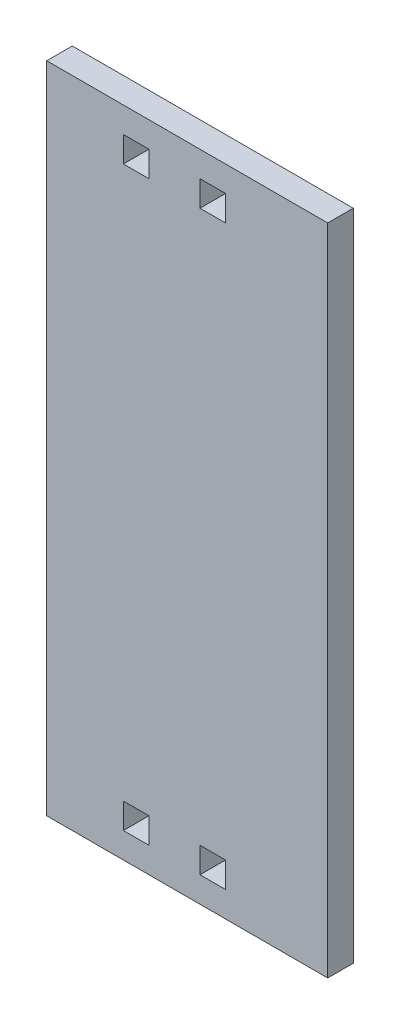
ISO-10303-21;
HEADER;
FILE_DESCRIPTION(('STEP AP214'),'2;1');
FILE_NAME('part.step','',(''),(''),'','','');
FILE_SCHEMA(('AUTOMOTIVE_DESIGN { 1 0 10303 214 1 1 1 1 }'));
ENDSEC;
DATA;
#1=APPLICATION_CONTEXT('core data for automotive mechanical design processes');
#2=APPLICATION_PROTOCOL_DEFINITION('international standard','automotive_design',2000,#1);
#3=PRODUCT_CONTEXT('',#1,'mechanical');
#4=PRODUCT('Part','Part','',(#3));
#5=PRODUCT_RELATED_PRODUCT_CATEGORY('part','',(#4));
#6=PRODUCT_DEFINITION_FORMATION('','',#4);
#7=PRODUCT_DEFINITION_CONTEXT('part definition',#1,'design');
#8=PRODUCT_DEFINITION('design','',#6,#7);
#9=PRODUCT_DEFINITION_SHAPE('','',#8);
#10=(LENGTH_UNIT() NAMED_UNIT(*) SI_UNIT(.MILLI.,.METRE.));
#11=(NAMED_UNIT(*) PLANE_ANGLE_UNIT() SI_UNIT($,.RADIAN.));
#12=(NAMED_UNIT(*) SI_UNIT($,.STERADIAN.) SOLID_ANGLE_UNIT());
#13=UNCERTAINTY_MEASURE_WITH_UNIT(LENGTH_MEASURE(1.E-05),#10,'distance_accuracy_value','');
#14=(GEOMETRIC_REPRESENTATION_CONTEXT(3) GLOBAL_UNCERTAINTY_ASSIGNED_CONTEXT((#13)) GLOBAL_UNIT_ASSIGNED_CONTEXT((#10,
#11,#12)) REPRESENTATION_CONTEXT('',''));
#15=CARTESIAN_POINT('',(0.,0.,0.));
#16=DIRECTION('',(0.,0.,1.));
#17=DIRECTION('',(1.,0.,0.));
#18=AXIS2_PLACEMENT_3D('',#15,#16,#17);
#19=CARTESIAN_POINT('',(0.,110.5,5.));
#20=DIRECTION('',(0.,-1.,0.));
#21=DIRECTION('',(0.,0.,-1.));
#22=AXIS2_PLACEMENT_3D('',#19,#20,#21);
#23=PLANE('',#22);
#24=DIRECTION('',(-1.,0.,0.));
#25=VECTOR('',#24,1.);
#26=CARTESIAN_POINT('',(0.,110.5,0.));
#27=LINE('',#26,#25);
#28=CARTESIAN_POINT('',(-4.99999999999998,110.5,0.));
#29=VERTEX_POINT('',#28);
#30=CARTESIAN_POINT('',(-9.99999999999999,110.5,0.));
#31=VERTEX_POINT('',#30);
#32=EDGE_CURVE('E403',#29,#31,#27,.T.);
#33=ORIENTED_EDGE('',*,*,#32,.T.);
#34=DIRECTION('',(0.,0.,-1.));
#35=VECTOR('',#34,1.);
#36=CARTESIAN_POINT('',(-9.99999999999999,110.5,5.));
#37=LINE('',#36,#35);
#38=CARTESIAN_POINT('',(-9.99999999999999,110.5,5.));
#39=VERTEX_POINT('',#38);
#40=EDGE_CURVE('E12',#39,#31,#37,.T.);
#41=ORIENTED_EDGE('',*,*,#40,.F.);
#42=DIRECTION('',(-1.,0.,0.));
#43=VECTOR('',#42,1.);
#44=CARTESIAN_POINT('',(0.,110.5,5.));
#45=LINE('',#44,#43);
#46=CARTESIAN_POINT('',(-4.99999999999998,110.5,5.));
#47=VERTEX_POINT('',#46);
#48=EDGE_CURVE('E193',#47,#39,#45,.T.);
#49=ORIENTED_EDGE('',*,*,#48,.F.);
#50=DIRECTION('',(0.,0.,-1.));
#51=VECTOR('',#50,1.);
#52=CARTESIAN_POINT('',(-4.99999999999998,110.5,5.));
#53=LINE('',#52,#51);
#54=EDGE_CURVE('E61',#47,#29,#53,.T.);
#55=ORIENTED_EDGE('',*,*,#54,.T.);
#56=EDGE_LOOP('',(#33,#41,#49,#55));
#57=FACE_BOUND('',#56,.T.);
#58=ADVANCED_FACE('F42',(#57),#23,.F.);
#59=CARTESIAN_POINT('',(-9.99999999999999,0.,5.));
#60=DIRECTION('',(-1.,0.,0.));
#61=DIRECTION('',(0.,0.,1.));
#62=AXIS2_PLACEMENT_3D('',#59,#60,#61);
#63=PLANE('',#62);
#64=DIRECTION('',(0.,1.,0.));
#65=VECTOR('',#64,1.);
#66=CARTESIAN_POINT('',(-9.99999999999999,0.,0.));
#67=LINE('',#66,#65);
#68=CARTESIAN_POINT('',(-9.99999999999999,115.5,0.));
#69=VERTEX_POINT('',#68);
#70=EDGE_CURVE('E200',#31,#69,#67,.T.);
#71=ORIENTED_EDGE('',*,*,#70,.T.);
#72=DIRECTION('',(0.,0.,-1.));
#73=VECTOR('',#72,1.);
#74=CARTESIAN_POINT('',(-9.99999999999999,115.5,5.));
#75=LINE('',#74,#73);
#76=CARTESIAN_POINT('',(-9.99999999999999,115.5,5.));
#77=VERTEX_POINT('',#76);
#78=EDGE_CURVE('E52',#77,#69,#75,.T.);
#79=ORIENTED_EDGE('',*,*,#78,.F.);
#80=DIRECTION('',(0.,1.,0.));
#81=VECTOR('',#80,1.);
#82=CARTESIAN_POINT('',(-9.99999999999999,0.,5.));
#83=LINE('',#82,#81);
#84=EDGE_CURVE('E187',#39,#77,#83,.T.);
#85=ORIENTED_EDGE('',*,*,#84,.F.);
#86=ORIENTED_EDGE('',*,*,#40,.T.);
#87=EDGE_LOOP('',(#71,#79,#85,#86));
#88=FACE_BOUND('',#87,.T.);
#89=ADVANCED_FACE('F199',(#88),#63,.F.);
#90=CARTESIAN_POINT('',(0.,115.5,5.));
#91=DIRECTION('',(0.,-1.,0.));
#92=DIRECTION('',(0.,0.,-1.));
#93=AXIS2_PLACEMENT_3D('',#90,#91,#92);
#94=PLANE('',#93);
#95=DIRECTION('',(-1.,0.,0.));
#96=VECTOR('',#95,1.);
#97=CARTESIAN_POINT('',(0.,115.5,0.));
#98=LINE('',#97,#96);
#99=CARTESIAN_POINT('',(-4.99999999999998,115.5,0.));
#100=VERTEX_POINT('',#99);
#101=EDGE_CURVE('E306',#100,#69,#98,.T.);
#102=ORIENTED_EDGE('',*,*,#101,.F.);
#103=DIRECTION('',(0.,0.,-1.));
#104=VECTOR('',#103,1.);
#105=CARTESIAN_POINT('',(-4.99999999999998,115.5,5.));
#106=LINE('',#105,#104);
#107=CARTESIAN_POINT('',(-4.99999999999998,115.5,5.));
#108=VERTEX_POINT('',#107);
#109=EDGE_CURVE('E123',#108,#100,#106,.T.);
#110=ORIENTED_EDGE('',*,*,#109,.F.);
#111=DIRECTION('',(-1.,0.,0.));
#112=VECTOR('',#111,1.);
#113=CARTESIAN_POINT('',(0.,115.5,5.));
#114=LINE('',#113,#112);
#115=EDGE_CURVE('E192',#108,#77,#114,.T.);
#116=ORIENTED_EDGE('',*,*,#115,.T.);
#117=ORIENTED_EDGE('',*,*,#78,.T.);
#118=EDGE_LOOP('',(#102,#110,#116,#117));
#119=FACE_BOUND('',#118,.T.);
#120=ADVANCED_FACE('F204',(#119),#94,.T.);
#121=CARTESIAN_POINT('',(0.,2.5,5.));
#122=DIRECTION('',(0.,1.,0.));
#123=DIRECTION('',(0.,0.,1.));
#124=AXIS2_PLACEMENT_3D('',#121,#122,#123);
#125=PLANE('',#124);
#126=DIRECTION('',(1.,0.,0.));
#127=VECTOR('',#126,1.);
#128=CARTESIAN_POINT('',(0.,2.5,0.));
#129=LINE('',#128,#127);
#130=CARTESIAN_POINT('',(5.,2.5,0.));
#131=VERTEX_POINT('',#130);
#132=CARTESIAN_POINT('',(10.,2.5,0.));
#133=VERTEX_POINT('',#132);
#134=EDGE_CURVE('E391',#131,#133,#129,.T.);
#135=ORIENTED_EDGE('',*,*,#134,.T.);
#136=DIRECTION('',(0.,0.,-1.));
#137=VECTOR('',#136,1.);
#138=CARTESIAN_POINT('',(10.,2.5,5.));
#139=LINE('',#138,#137);
#140=CARTESIAN_POINT('',(10.,2.5,5.));
#141=VERTEX_POINT('',#140);
#142=EDGE_CURVE('E313',#141,#133,#139,.T.);
#143=ORIENTED_EDGE('',*,*,#142,.F.);
#144=DIRECTION('',(1.,0.,0.));
#145=VECTOR('',#144,1.);
#146=CARTESIAN_POINT('',(0.,2.5,5.));
#147=LINE('',#146,#145);
#148=CARTESIAN_POINT('',(5.,2.5,5.));
#149=VERTEX_POINT('',#148);
#150=EDGE_CURVE('E240',#149,#141,#147,.T.);
#151=ORIENTED_EDGE('',*,*,#150,.F.);
#152=DIRECTION('',(0.,0.,-1.));
#153=VECTOR('',#152,1.);
#154=CARTESIAN_POINT('',(5.,2.5,5.));
#155=LINE('',#154,#153);
#156=EDGE_CURVE('E315',#149,#131,#155,.T.);
#157=ORIENTED_EDGE('',*,*,#156,.T.);
#158=EDGE_LOOP('',(#135,#143,#151,#157));
#159=FACE_BOUND('',#158,.T.);
#160=ADVANCED_FACE('F440',(#159),#125,.F.);
#161=CARTESIAN_POINT('',(10.,0.,5.));
#162=DIRECTION('',(1.,0.,0.));
#163=DIRECTION('',(0.,0.,-1.));
#164=AXIS2_PLACEMENT_3D('',#161,#162,#163);
#165=PLANE('',#164);
#166=DIRECTION('',(0.,-1.,0.));
#167=VECTOR('',#166,1.);
#168=CARTESIAN_POINT('',(10.,0.,0.));
#169=LINE('',#168,#167);
#170=CARTESIAN_POINT('',(10.,-2.5,0.));
#171=VERTEX_POINT('',#170);
#172=EDGE_CURVE('E394',#133,#171,#169,.T.);
#173=ORIENTED_EDGE('',*,*,#172,.T.);
#174=DIRECTION('',(0.,0.,-1.));
#175=VECTOR('',#174,1.);
#176=CARTESIAN_POINT('',(10.,-2.5,5.));
#177=LINE('',#176,#175);
#178=CARTESIAN_POINT('',(10.,-2.5,5.));
#179=VERTEX_POINT('',#178);
#180=EDGE_CURVE('E320',#179,#171,#177,.T.);
#181=ORIENTED_EDGE('',*,*,#180,.F.);
#182=DIRECTION('',(0.,-1.,0.));
#183=VECTOR('',#182,1.);
#184=CARTESIAN_POINT('',(10.,0.,5.));
#185=LINE('',#184,#183);
#186=EDGE_CURVE('E232',#141,#179,#185,.T.);
#187=ORIENTED_EDGE('',*,*,#186,.F.);
#188=ORIENTED_EDGE('',*,*,#142,.T.);
#189=EDGE_LOOP('',(#173,#181,#187,#188));
#190=FACE_BOUND('',#189,.T.);
#191=ADVANCED_FACE('F436',(#190),#165,.F.);
#192=CARTESIAN_POINT('',(0.,-2.5,5.));
#193=DIRECTION('',(0.,1.,0.));
#194=DIRECTION('',(0.,0.,1.));
#195=AXIS2_PLACEMENT_3D('',#192,#193,#194);
#196=PLANE('',#195);
#197=DIRECTION('',(1.,0.,0.));
#198=VECTOR('',#197,1.);
#199=CARTESIAN_POINT('',(0.,-2.5,0.));
#200=LINE('',#199,#198);
#201=CARTESIAN_POINT('',(5.,-2.5,0.));
#202=VERTEX_POINT('',#201);
#203=EDGE_CURVE('E397',#202,#171,#200,.T.);
#204=ORIENTED_EDGE('',*,*,#203,.F.);
#205=DIRECTION('',(0.,0.,-1.));
#206=VECTOR('',#205,1.);
#207=CARTESIAN_POINT('',(5.,-2.5,5.));
#208=LINE('',#207,#206);
#209=CARTESIAN_POINT('',(5.,-2.5,5.));
#210=VERTEX_POINT('',#209);
#211=EDGE_CURVE('E317',#210,#202,#208,.T.);
#212=ORIENTED_EDGE('',*,*,#211,.F.);
#213=DIRECTION('',(1.,0.,0.));
#214=VECTOR('',#213,1.);
#215=CARTESIAN_POINT('',(0.,-2.5,5.));
#216=LINE('',#215,#214);
#217=EDGE_CURVE('E227',#210,#179,#216,.T.);
#218=ORIENTED_EDGE('',*,*,#217,.T.);
#219=ORIENTED_EDGE('',*,*,#180,.T.);
#220=EDGE_LOOP('',(#204,#212,#218,#219));
#221=FACE_BOUND('',#220,.T.);
#222=ADVANCED_FACE('F432',(#221),#196,.T.);
#223=CARTESIAN_POINT('',(0.,-7.5,5.));
#224=DIRECTION('',(0.,-1.,0.));
#225=DIRECTION('',(1.,0.,0.));
#226=AXIS2_PLACEMENT_3D('',#223,#224,#225);
#227=PLANE('',#226);
#228=DIRECTION('',(-1.,0.,0.));
#229=VECTOR('',#228,1.);
#230=CARTESIAN_POINT('',(0.,-7.5,0.));
#231=LINE('',#230,#229);
#232=CARTESIAN_POINT('',(30.,-7.5,0.));
#233=VERTEX_POINT('',#232);
#234=CARTESIAN_POINT('',(-25.,-7.50000000000001,0.));
#235=VERTEX_POINT('',#234);
#236=EDGE_CURVE('E379',#233,#235,#231,.T.);
#237=ORIENTED_EDGE('',*,*,#236,.F.);
#238=DIRECTION('',(0.,0.,-1.));
#239=VECTOR('',#238,1.);
#240=CARTESIAN_POINT('',(30.,-7.5,5.));
#241=LINE('',#240,#239);
#242=CARTESIAN_POINT('',(30.,-7.5,5.));
#243=VERTEX_POINT('',#242);
#244=EDGE_CURVE('E318',#243,#233,#241,.T.);
#245=ORIENTED_EDGE('',*,*,#244,.F.);
#246=DIRECTION('',(-1.,0.,0.));
#247=VECTOR('',#246,1.);
#248=CARTESIAN_POINT('',(0.,-7.5,5.));
#249=LINE('',#248,#247);
#250=CARTESIAN_POINT('',(-25.,-7.50000000000001,5.));
#251=VERTEX_POINT('',#250);
#252=EDGE_CURVE('E261',#243,#251,#249,.T.);
#253=ORIENTED_EDGE('',*,*,#252,.T.);
#254=DIRECTION('',(0.,0.,-1.));
#255=VECTOR('',#254,1.);
#256=CARTESIAN_POINT('',(-25.,-7.50000000000001,5.));
#257=LINE('',#256,#255);
#258=EDGE_CURVE('E324',#251,#235,#257,.T.);
#259=ORIENTED_EDGE('',*,*,#258,.T.);
#260=EDGE_LOOP('',(#237,#245,#253,#259));
#261=FACE_BOUND('',#260,.T.);
#262=ADVANCED_FACE('F435',(#261),#227,.T.);
#263=CARTESIAN_POINT('',(30.,0.,5.));
#264=DIRECTION('',(1.,0.,0.));
#265=DIRECTION('',(0.,1.,0.));
#266=AXIS2_PLACEMENT_3D('',#263,#264,#265);
#267=PLANE('',#266);
#268=DIRECTION('',(0.,-1.,0.));
#269=VECTOR('',#268,1.);
#270=CARTESIAN_POINT('',(30.,0.,0.));
#271=LINE('',#270,#269);
#272=CARTESIAN_POINT('',(30.,120.5,0.));
#273=VERTEX_POINT('',#272);
#274=EDGE_CURVE('E382',#273,#233,#271,.T.);
#275=ORIENTED_EDGE('',*,*,#274,.F.);
#276=DIRECTION('',(0.,0.,-1.));
#277=VECTOR('',#276,1.);
#278=CARTESIAN_POINT('',(30.,120.5,5.));
#279=LINE('',#278,#277);
#280=CARTESIAN_POINT('',(30.,120.5,5.));
#281=VERTEX_POINT('',#280);
#282=EDGE_CURVE('E329',#281,#273,#279,.T.);
#283=ORIENTED_EDGE('',*,*,#282,.F.);
#284=DIRECTION('',(0.,-1.,0.));
#285=VECTOR('',#284,1.);
#286=CARTESIAN_POINT('',(30.,0.,5.));
#287=LINE('',#286,#285);
#288=EDGE_CURVE('E253',#281,#243,#287,.T.);
#289=ORIENTED_EDGE('',*,*,#288,.T.);
#290=ORIENTED_EDGE('',*,*,#244,.T.);
#291=EDGE_LOOP('',(#275,#283,#289,#290));
#292=FACE_BOUND('',#291,.T.);
#293=ADVANCED_FACE('F452',(#292),#267,.T.);
#294=CARTESIAN_POINT('',(0.,120.5,5.));
#295=DIRECTION('',(0.,1.,0.));
#296=DIRECTION('',(0.,0.,1.));
#297=AXIS2_PLACEMENT_3D('',#294,#295,#296);
#298=PLANE('',#297);
#299=DIRECTION('',(1.,0.,0.));
#300=VECTOR('',#299,1.);
#301=CARTESIAN_POINT('',(0.,120.5,0.));
#302=LINE('',#301,#300);
#303=CARTESIAN_POINT('',(-25.,120.5,0.));
#304=VERTEX_POINT('',#303);
#305=EDGE_CURVE('E385',#304,#273,#302,.T.);
#306=ORIENTED_EDGE('',*,*,#305,.F.);
#307=DIRECTION('',(0.,0.,-1.));
#308=VECTOR('',#307,1.);
#309=CARTESIAN_POINT('',(-25.,120.5,5.));
#310=LINE('',#309,#308);
#311=CARTESIAN_POINT('',(-25.,120.5,5.));
#312=VERTEX_POINT('',#311);
#313=EDGE_CURVE('E326',#312,#304,#310,.T.);
#314=ORIENTED_EDGE('',*,*,#313,.F.);
#315=DIRECTION('',(1.,0.,0.));
#316=VECTOR('',#315,1.);
#317=CARTESIAN_POINT('',(0.,120.5,5.));
#318=LINE('',#317,#316);
#319=EDGE_CURVE('E248',#312,#281,#318,.T.);
#320=ORIENTED_EDGE('',*,*,#319,.T.);
#321=ORIENTED_EDGE('',*,*,#282,.T.);
#322=EDGE_LOOP('',(#306,#314,#320,#321));
#323=FACE_BOUND('',#322,.T.);
#324=ADVANCED_FACE('F448',(#323),#298,.T.);
#325=CARTESIAN_POINT('',(-10.,0.,5.));
#326=DIRECTION('',(1.,0.,0.));
#327=DIRECTION('',(0.,0.,-1.));
#328=AXIS2_PLACEMENT_3D('',#325,#326,#327);
#329=PLANE('',#328);
#330=DIRECTION('',(0.,-1.,0.));
#331=VECTOR('',#330,1.);
#332=CARTESIAN_POINT('',(-10.,0.,0.));
#333=LINE('',#332,#331);
#334=CARTESIAN_POINT('',(-10.,2.5,0.));
#335=VERTEX_POINT('',#334);
#336=CARTESIAN_POINT('',(-10.,-2.5,0.));
#337=VERTEX_POINT('',#336);
#338=EDGE_CURVE('E367',#335,#337,#333,.T.);
#339=ORIENTED_EDGE('',*,*,#338,.F.);
#340=DIRECTION('',(0.,0.,-1.));
#341=VECTOR('',#340,1.);
#342=CARTESIAN_POINT('',(-10.,2.5,5.));
#343=LINE('',#342,#341);
#344=CARTESIAN_POINT('',(-10.,2.5,5.));
#345=VERTEX_POINT('',#344);
#346=EDGE_CURVE('E327',#345,#335,#343,.T.);
#347=ORIENTED_EDGE('',*,*,#346,.F.);
#348=DIRECTION('',(0.,-1.,0.));
#349=VECTOR('',#348,1.);
#350=CARTESIAN_POINT('',(-10.,0.,5.));
#351=LINE('',#350,#349);
#352=CARTESIAN_POINT('',(-10.,-2.5,5.));
#353=VERTEX_POINT('',#352);
#354=EDGE_CURVE('E282',#345,#353,#351,.T.);
#355=ORIENTED_EDGE('',*,*,#354,.T.);
#356=DIRECTION('',(0.,0.,-1.));
#357=VECTOR('',#356,1.);
#358=CARTESIAN_POINT('',(-10.,-2.5,5.));
#359=LINE('',#358,#357);
#360=EDGE_CURVE('E332',#353,#337,#359,.T.);
#361=ORIENTED_EDGE('',*,*,#360,.T.);
#362=EDGE_LOOP('',(#339,#347,#355,#361));
#363=FACE_BOUND('',#362,.T.);
#364=ADVANCED_FACE('F451',(#363),#329,.T.);
#365=CARTESIAN_POINT('',(0.,2.5,5.));
#366=DIRECTION('',(0.,-1.,0.));
#367=DIRECTION('',(1.,0.,0.));
#368=AXIS2_PLACEMENT_3D('',#365,#366,#367);
#369=PLANE('',#368);
#370=DIRECTION('',(-1.,0.,0.));
#371=VECTOR('',#370,1.);
#372=CARTESIAN_POINT('',(0.,2.5,0.));
#373=LINE('',#372,#371);
#374=CARTESIAN_POINT('',(-5.,2.5,0.));
#375=VERTEX_POINT('',#374);
#376=EDGE_CURVE('E370',#375,#335,#373,.T.);
#377=ORIENTED_EDGE('',*,*,#376,.F.);
#378=DIRECTION('',(0.,0.,-1.));
#379=VECTOR('',#378,1.);
#380=CARTESIAN_POINT('',(-5.,2.5,5.));
#381=LINE('',#380,#379);
#382=CARTESIAN_POINT('',(-5.,2.5,5.));
#383=VERTEX_POINT('',#382);
#384=EDGE_CURVE('E337',#383,#375,#381,.T.);
#385=ORIENTED_EDGE('',*,*,#384,.F.);
#386=DIRECTION('',(-1.,0.,0.));
#387=VECTOR('',#386,1.);
#388=CARTESIAN_POINT('',(0.,2.5,5.));
#389=LINE('',#388,#387);
#390=EDGE_CURVE('E274',#383,#345,#389,.T.);
#391=ORIENTED_EDGE('',*,*,#390,.T.);
#392=ORIENTED_EDGE('',*,*,#346,.T.);
#393=EDGE_LOOP('',(#377,#385,#391,#392));
#394=FACE_BOUND('',#393,.T.);
#395=ADVANCED_FACE('F466',(#394),#369,.T.);
#396=CARTESIAN_POINT('',(-5.,0.,5.));
#397=DIRECTION('',(1.,0.,0.));
#398=DIRECTION('',(0.,0.,-1.));
#399=AXIS2_PLACEMENT_3D('',#396,#397,#398);
#400=PLANE('',#399);
#401=DIRECTION('',(0.,-1.,0.));
#402=VECTOR('',#401,1.);
#403=CARTESIAN_POINT('',(-5.,0.,0.));
#404=LINE('',#403,#402);
#405=CARTESIAN_POINT('',(-5.,-2.5,0.));
#406=VERTEX_POINT('',#405);
#407=EDGE_CURVE('E373',#375,#406,#404,.T.);
#408=ORIENTED_EDGE('',*,*,#407,.T.);
#409=DIRECTION('',(0.,0.,-1.));
#410=VECTOR('',#409,1.);
#411=CARTESIAN_POINT('',(-5.,-2.5,5.));
#412=LINE('',#411,#410);
#413=CARTESIAN_POINT('',(-5.,-2.5,5.));
#414=VERTEX_POINT('',#413);
#415=EDGE_CURVE('E334',#414,#406,#412,.T.);
#416=ORIENTED_EDGE('',*,*,#415,.F.);
#417=DIRECTION('',(0.,-1.,0.));
#418=VECTOR('',#417,1.);
#419=CARTESIAN_POINT('',(-5.,0.,5.));
#420=LINE('',#419,#418);
#421=EDGE_CURVE('E269',#383,#414,#420,.T.);
#422=ORIENTED_EDGE('',*,*,#421,.F.);
#423=ORIENTED_EDGE('',*,*,#384,.T.);
#424=EDGE_LOOP('',(#408,#416,#422,#423));
#425=FACE_BOUND('',#424,.T.);
#426=ADVANCED_FACE('F463',(#425),#400,.F.);
#427=CARTESIAN_POINT('',(10.,0.,5.));
#428=DIRECTION('',(-1.,0.,0.));
#429=DIRECTION('',(0.,0.,1.));
#430=AXIS2_PLACEMENT_3D('',#427,#428,#429);
#431=PLANE('',#430);
#432=DIRECTION('',(0.,1.,0.));
#433=VECTOR('',#432,1.);
#434=CARTESIAN_POINT('',(10.,0.,0.));
#435=LINE('',#434,#433);
#436=CARTESIAN_POINT('',(10.,110.5,0.));
#437=VERTEX_POINT('',#436);
#438=CARTESIAN_POINT('',(10.,115.5,0.));
#439=VERTEX_POINT('',#438);
#440=EDGE_CURVE('E354',#437,#439,#435,.T.);
#441=ORIENTED_EDGE('',*,*,#440,.F.);
#442=DIRECTION('',(0.,0.,-1.));
#443=VECTOR('',#442,1.);
#444=CARTESIAN_POINT('',(10.,110.5,5.));
#445=LINE('',#444,#443);
#446=CARTESIAN_POINT('',(10.,110.5,5.));
#447=VERTEX_POINT('',#446);
#448=EDGE_CURVE('E46',#447,#437,#445,.T.);
#449=ORIENTED_EDGE('',*,*,#448,.F.);
#450=DIRECTION('',(0.,1.,0.));
#451=VECTOR('',#450,1.);
#452=CARTESIAN_POINT('',(10.,0.,5.));
#453=LINE('',#452,#451);
#454=CARTESIAN_POINT('',(10.,115.5,5.));
#455=VERTEX_POINT('',#454);
#456=EDGE_CURVE('E299',#447,#455,#453,.T.);
#457=ORIENTED_EDGE('',*,*,#456,.T.);
#458=DIRECTION('',(0.,0.,-1.));
#459=VECTOR('',#458,1.);
#460=CARTESIAN_POINT('',(10.,115.5,5.));
#461=LINE('',#460,#459);
#462=EDGE_CURVE('E209',#455,#439,#461,.T.);
#463=ORIENTED_EDGE('',*,*,#462,.T.);
#464=EDGE_LOOP('',(#441,#449,#457,#463));
#465=FACE_BOUND('',#464,.T.);
#466=ADVANCED_FACE('F44',(#465),#431,.T.);
#467=CARTESIAN_POINT('',(0.,110.5,5.));
#468=DIRECTION('',(0.,1.,0.));
#469=DIRECTION('',(0.,0.,1.));
#470=AXIS2_PLACEMENT_3D('',#467,#468,#469);
#471=PLANE('',#470);
#472=DIRECTION('',(1.,0.,0.));
#473=VECTOR('',#472,1.);
#474=CARTESIAN_POINT('',(0.,110.5,0.));
#475=LINE('',#474,#473);
#476=CARTESIAN_POINT('',(5.00000000000002,110.5,0.));
#477=VERTEX_POINT('',#476);
#478=EDGE_CURVE('E351',#477,#437,#475,.T.);
#479=ORIENTED_EDGE('',*,*,#478,.F.);
#480=DIRECTION('',(0.,0.,-1.));
#481=VECTOR('',#480,1.);
#482=CARTESIAN_POINT('',(5.00000000000002,110.5,5.));
#483=LINE('',#482,#481);
#484=CARTESIAN_POINT('',(5.00000000000002,110.5,5.));
#485=VERTEX_POINT('',#484);
#486=EDGE_CURVE('E343',#485,#477,#483,.T.);
#487=ORIENTED_EDGE('',*,*,#486,.F.);
#488=DIRECTION('',(1.,0.,0.));
#489=VECTOR('',#488,1.);
#490=CARTESIAN_POINT('',(0.,110.5,5.));
#491=LINE('',#490,#489);
#492=EDGE_CURVE('E294',#485,#447,#491,.T.);
#493=ORIENTED_EDGE('',*,*,#492,.T.);
#494=ORIENTED_EDGE('',*,*,#448,.T.);
#495=EDGE_LOOP('',(#479,#487,#493,#494));
#496=FACE_BOUND('',#495,.T.);
#497=ADVANCED_FACE('F349',(#496),#471,.T.);
#498=CARTESIAN_POINT('',(5.00000000000002,0.,5.));
#499=DIRECTION('',(-1.,0.,0.));
#500=DIRECTION('',(0.,0.,1.));
#501=AXIS2_PLACEMENT_3D('',#498,#499,#500);
#502=PLANE('',#501);
#503=DIRECTION('',(0.,1.,0.));
#504=VECTOR('',#503,1.);
#505=CARTESIAN_POINT('',(5.00000000000002,0.,0.));
#506=LINE('',#505,#504);
#507=CARTESIAN_POINT('',(5.00000000000002,115.5,0.));
#508=VERTEX_POINT('',#507);
#509=EDGE_CURVE('E361',#477,#508,#506,.T.);
#510=ORIENTED_EDGE('',*,*,#509,.T.);
#511=DIRECTION('',(0.,0.,-1.));
#512=VECTOR('',#511,1.);
#513=CARTESIAN_POINT('',(5.00000000000002,115.5,5.));
#514=LINE('',#513,#512);
#515=CARTESIAN_POINT('',(5.00000000000002,115.5,5.));
#516=VERTEX_POINT('',#515);
#517=EDGE_CURVE('E341',#516,#508,#514,.T.);
#518=ORIENTED_EDGE('',*,*,#517,.F.);
#519=DIRECTION('',(0.,1.,0.));
#520=VECTOR('',#519,1.);
#521=CARTESIAN_POINT('',(5.00000000000002,0.,5.));
#522=LINE('',#521,#520);
#523=EDGE_CURVE('E290',#485,#516,#522,.T.);
#524=ORIENTED_EDGE('',*,*,#523,.F.);
#525=ORIENTED_EDGE('',*,*,#486,.T.);
#526=EDGE_LOOP('',(#510,#518,#524,#525));
#527=FACE_BOUND('',#526,.T.);
#528=ADVANCED_FACE('F430',(#527),#502,.F.);
#529=CARTESIAN_POINT('',(5.,0.,5.));
#530=DIRECTION('',(1.,0.,0.));
#531=DIRECTION('',(0.,0.,-1.));
#532=AXIS2_PLACEMENT_3D('',#529,#530,#531);
#533=PLANE('',#532);
#534=DIRECTION('',(0.,-1.,0.));
#535=VECTOR('',#534,1.);
#536=CARTESIAN_POINT('',(5.,0.,0.));
#537=LINE('',#536,#535);
#538=EDGE_CURVE('E400',#131,#202,#537,.T.);
#539=ORIENTED_EDGE('',*,*,#538,.F.);
#540=ORIENTED_EDGE('',*,*,#156,.F.);
#541=DIRECTION('',(0.,-1.,0.));
#542=VECTOR('',#541,1.);
#543=CARTESIAN_POINT('',(5.,0.,5.));
#544=LINE('',#543,#542);
#545=EDGE_CURVE('E222',#149,#210,#544,.T.);
#546=ORIENTED_EDGE('',*,*,#545,.T.);
#547=ORIENTED_EDGE('',*,*,#211,.T.);
#548=EDGE_LOOP('',(#539,#540,#546,#547));
#549=FACE_BOUND('',#548,.T.);
#550=ADVANCED_FACE('F426',(#549),#533,.T.);
#551=CARTESIAN_POINT('',(-25.,0.,5.));
#552=DIRECTION('',(1.,0.,0.));
#553=DIRECTION('',(0.,1.,0.));
#554=AXIS2_PLACEMENT_3D('',#551,#552,#553);
#555=PLANE('',#554);
#556=DIRECTION('',(0.,-1.,0.));
#557=VECTOR('',#556,1.);
#558=CARTESIAN_POINT('',(-25.,0.,0.));
#559=LINE('',#558,#557);
#560=EDGE_CURVE('E388',#304,#235,#559,.T.);
#561=ORIENTED_EDGE('',*,*,#560,.T.);
#562=ORIENTED_EDGE('',*,*,#258,.F.);
#563=DIRECTION('',(0.,-1.,0.));
#564=VECTOR('',#563,1.);
#565=CARTESIAN_POINT('',(-25.,0.,5.));
#566=LINE('',#565,#564);
#567=EDGE_CURVE('E244',#312,#251,#566,.T.);
#568=ORIENTED_EDGE('',*,*,#567,.F.);
#569=ORIENTED_EDGE('',*,*,#313,.T.);
#570=EDGE_LOOP('',(#561,#562,#568,#569));
#571=FACE_BOUND('',#570,.T.);
#572=ADVANCED_FACE('F429',(#571),#555,.F.);
#573=CARTESIAN_POINT('',(0.,-2.5,5.));
#574=DIRECTION('',(0.,-1.,0.));
#575=DIRECTION('',(1.,0.,0.));
#576=AXIS2_PLACEMENT_3D('',#573,#574,#575);
#577=PLANE('',#576);
#578=DIRECTION('',(-1.,0.,0.));
#579=VECTOR('',#578,1.);
#580=CARTESIAN_POINT('',(0.,-2.5,0.));
#581=LINE('',#580,#579);
#582=EDGE_CURVE('E376',#406,#337,#581,.T.);
#583=ORIENTED_EDGE('',*,*,#582,.T.);
#584=ORIENTED_EDGE('',*,*,#360,.F.);
#585=DIRECTION('',(-1.,0.,0.));
#586=VECTOR('',#585,1.);
#587=CARTESIAN_POINT('',(0.,-2.5,5.));
#588=LINE('',#587,#586);
#589=EDGE_CURVE('E265',#414,#353,#588,.T.);
#590=ORIENTED_EDGE('',*,*,#589,.F.);
#591=ORIENTED_EDGE('',*,*,#415,.T.);
#592=EDGE_LOOP('',(#583,#584,#590,#591));
#593=FACE_BOUND('',#592,.T.);
#594=ADVANCED_FACE('F414',(#593),#577,.F.);
#595=CARTESIAN_POINT('',(0.,115.5,5.));
#596=DIRECTION('',(0.,1.,0.));
#597=DIRECTION('',(0.,0.,1.));
#598=AXIS2_PLACEMENT_3D('',#595,#596,#597);
#599=PLANE('',#598);
#600=DIRECTION('',(1.,0.,0.));
#601=VECTOR('',#600,1.);
#602=CARTESIAN_POINT('',(0.,115.5,0.));
#603=LINE('',#602,#601);
#604=EDGE_CURVE('E363',#508,#439,#603,.T.);
#605=ORIENTED_EDGE('',*,*,#604,.T.);
#606=ORIENTED_EDGE('',*,*,#462,.F.);
#607=DIRECTION('',(1.,0.,0.));
#608=VECTOR('',#607,1.);
#609=CARTESIAN_POINT('',(0.,115.5,5.));
#610=LINE('',#609,#608);
#611=EDGE_CURVE('E286',#516,#455,#610,.T.);
#612=ORIENTED_EDGE('',*,*,#611,.F.);
#613=ORIENTED_EDGE('',*,*,#517,.T.);
#614=EDGE_LOOP('',(#605,#606,#612,#613));
#615=FACE_BOUND('',#614,.T.);
#616=ADVANCED_FACE('F406',(#615),#599,.F.);
#617=CARTESIAN_POINT('',(-4.99999999999998,0.,5.));
#618=DIRECTION('',(-1.,0.,0.));
#619=DIRECTION('',(0.,0.,1.));
#620=AXIS2_PLACEMENT_3D('',#617,#618,#619);
#621=PLANE('',#620);
#622=DIRECTION('',(0.,1.,0.));
#623=VECTOR('',#622,1.);
#624=CARTESIAN_POINT('',(-4.99999999999998,0.,0.));
#625=LINE('',#624,#623);
#626=EDGE_CURVE('E302',#29,#100,#625,.T.);
#627=ORIENTED_EDGE('',*,*,#626,.F.);
#628=ORIENTED_EDGE('',*,*,#54,.F.);
#629=DIRECTION('',(0.,1.,0.));
#630=VECTOR('',#629,1.);
#631=CARTESIAN_POINT('',(-4.99999999999998,0.,5.));
#632=LINE('',#631,#630);
#633=EDGE_CURVE('E206',#47,#108,#632,.T.);
#634=ORIENTED_EDGE('',*,*,#633,.T.);
#635=ORIENTED_EDGE('',*,*,#109,.T.);
#636=EDGE_LOOP('',(#627,#628,#634,#635));
#637=FACE_BOUND('',#636,.T.);
#638=ADVANCED_FACE('F404',(#637),#621,.T.);
#639=CARTESIAN_POINT('',(0.,0.,5.));
#640=DIRECTION('',(0.,0.,1.));
#641=DIRECTION('',(1.,0.,0.));
#642=AXIS2_PLACEMENT_3D('',#639,#640,#641);
#643=PLANE('',#642);
#644=ORIENTED_EDGE('',*,*,#456,.F.);
#645=ORIENTED_EDGE('',*,*,#492,.F.);
#646=ORIENTED_EDGE('',*,*,#523,.T.);
#647=ORIENTED_EDGE('',*,*,#611,.T.);
#648=EDGE_LOOP('',(#644,#645,#646,#647));
#649=FACE_BOUND('',#648,.T.);
#650=ORIENTED_EDGE('',*,*,#354,.F.);
#651=ORIENTED_EDGE('',*,*,#390,.F.);
#652=ORIENTED_EDGE('',*,*,#421,.T.);
#653=ORIENTED_EDGE('',*,*,#589,.T.);
#654=EDGE_LOOP('',(#650,#651,#652,#653));
#655=FACE_BOUND('',#654,.T.);
#656=ORIENTED_EDGE('',*,*,#252,.F.);
#657=ORIENTED_EDGE('',*,*,#288,.F.);
#658=ORIENTED_EDGE('',*,*,#319,.F.);
#659=ORIENTED_EDGE('',*,*,#567,.T.);
#660=EDGE_LOOP('',(#656,#657,#658,#659));
#661=FACE_BOUND('',#660,.T.);
#662=ORIENTED_EDGE('',*,*,#150,.T.);
#663=ORIENTED_EDGE('',*,*,#186,.T.);
#664=ORIENTED_EDGE('',*,*,#217,.F.);
#665=ORIENTED_EDGE('',*,*,#545,.F.);
#666=EDGE_LOOP('',(#662,#663,#664,#665));
#667=FACE_BOUND('',#666,.T.);
#668=ORIENTED_EDGE('',*,*,#48,.T.);
#669=ORIENTED_EDGE('',*,*,#84,.T.);
#670=ORIENTED_EDGE('',*,*,#115,.F.);
#671=ORIENTED_EDGE('',*,*,#633,.F.);
#672=EDGE_LOOP('',(#668,#669,#670,#671));
#673=FACE_BOUND('',#672,.T.);
#674=ADVANCED_FACE('F189',(#649,#655,#661,#667,#673),#643,.T.);
#675=CARTESIAN_POINT('',(0.,0.,0.));
#676=DIRECTION('',(0.,0.,1.));
#677=DIRECTION('',(1.,0.,0.));
#678=AXIS2_PLACEMENT_3D('',#675,#676,#677);
#679=PLANE('',#678);
#680=ORIENTED_EDGE('',*,*,#440,.T.);
#681=ORIENTED_EDGE('',*,*,#604,.F.);
#682=ORIENTED_EDGE('',*,*,#509,.F.);
#683=ORIENTED_EDGE('',*,*,#478,.T.);
#684=EDGE_LOOP('',(#680,#681,#682,#683));
#685=FACE_BOUND('',#684,.T.);
#686=ORIENTED_EDGE('',*,*,#338,.T.);
#687=ORIENTED_EDGE('',*,*,#582,.F.);
#688=ORIENTED_EDGE('',*,*,#407,.F.);
#689=ORIENTED_EDGE('',*,*,#376,.T.);
#690=EDGE_LOOP('',(#686,#687,#688,#689));
#691=FACE_BOUND('',#690,.T.);
#692=ORIENTED_EDGE('',*,*,#236,.T.);
#693=ORIENTED_EDGE('',*,*,#560,.F.);
#694=ORIENTED_EDGE('',*,*,#305,.T.);
#695=ORIENTED_EDGE('',*,*,#274,.T.);
#696=EDGE_LOOP('',(#692,#693,#694,#695));
#697=FACE_BOUND('',#696,.T.);
#698=ORIENTED_EDGE('',*,*,#134,.F.);
#699=ORIENTED_EDGE('',*,*,#538,.T.);
#700=ORIENTED_EDGE('',*,*,#203,.T.);
#701=ORIENTED_EDGE('',*,*,#172,.F.);
#702=EDGE_LOOP('',(#698,#699,#700,#701));
#703=FACE_BOUND('',#702,.T.);
#704=ORIENTED_EDGE('',*,*,#32,.F.);
#705=ORIENTED_EDGE('',*,*,#626,.T.);
#706=ORIENTED_EDGE('',*,*,#101,.T.);
#707=ORIENTED_EDGE('',*,*,#70,.F.);
#708=EDGE_LOOP('',(#704,#705,#706,#707));
#709=FACE_BOUND('',#708,.T.);
#710=ADVANCED_FACE('F359',(#685,#691,#697,#703,#709),#679,.F.);
#711=CLOSED_SHELL('',(#58,#89,#120,#160,#191,#222,#262,#293,#324,#364,#395,#426,#466,#497,#528,
#550,#572,#594,#616,#638,#674,#710));
#712=MANIFOLD_SOLID_BREP('B2',#711);
#713=ADVANCED_BREP_SHAPE_REPRESENTATION('',(#18,#712),#14);
#714=SHAPE_DEFINITION_REPRESENTATION(#9,#713);
ENDSEC;
END-ISO-10303-21;
